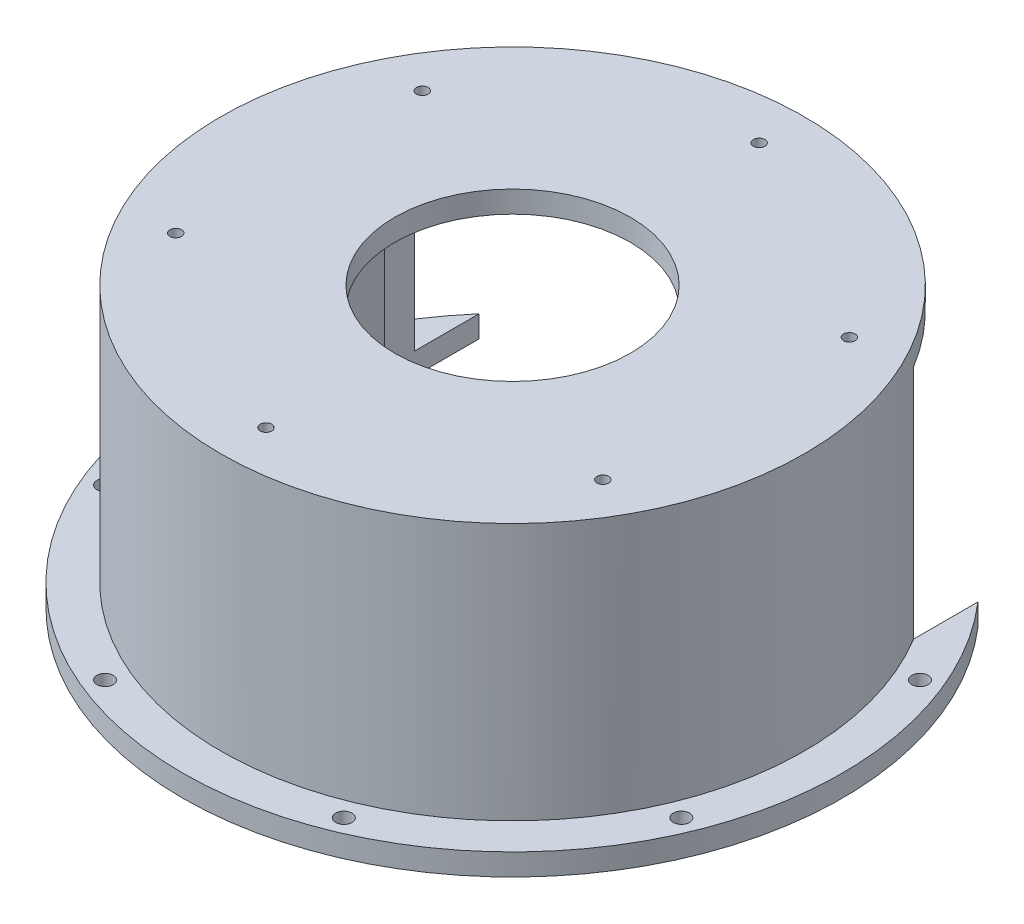
ISO-10303-21;
HEADER;
FILE_DESCRIPTION(('STEP AP214'),'2;1');
FILE_NAME('part.step','',(''),(''),'','','');
FILE_SCHEMA(('AUTOMOTIVE_DESIGN { 1 0 10303 214 1 1 1 1 }'));
ENDSEC;
DATA;
#1=APPLICATION_CONTEXT('core data for automotive mechanical design processes');
#2=APPLICATION_PROTOCOL_DEFINITION('international standard','automotive_design',2000,#1);
#3=PRODUCT_CONTEXT('',#1,'mechanical');
#4=PRODUCT('Part','Part','',(#3));
#5=PRODUCT_RELATED_PRODUCT_CATEGORY('part','',(#4));
#6=PRODUCT_DEFINITION_FORMATION('','',#4);
#7=PRODUCT_DEFINITION_CONTEXT('part definition',#1,'design');
#8=PRODUCT_DEFINITION('design','',#6,#7);
#9=PRODUCT_DEFINITION_SHAPE('','',#8);
#10=(LENGTH_UNIT() NAMED_UNIT(*) SI_UNIT(.MILLI.,.METRE.));
#11=(NAMED_UNIT(*) PLANE_ANGLE_UNIT() SI_UNIT($,.RADIAN.));
#12=(NAMED_UNIT(*) SI_UNIT($,.STERADIAN.) SOLID_ANGLE_UNIT());
#13=UNCERTAINTY_MEASURE_WITH_UNIT(LENGTH_MEASURE(1.E-05),#10,'distance_accuracy_value','');
#14=(GEOMETRIC_REPRESENTATION_CONTEXT(3) GLOBAL_UNCERTAINTY_ASSIGNED_CONTEXT((#13)) GLOBAL_UNIT_ASSIGNED_CONTEXT((#10,
#11,#12)) REPRESENTATION_CONTEXT('',''));
#15=CARTESIAN_POINT('',(0.,0.,0.));
#16=DIRECTION('',(0.,0.,1.));
#17=DIRECTION('',(1.,0.,0.));
#18=AXIS2_PLACEMENT_3D('',#15,#16,#17);
#19=CARTESIAN_POINT('',(0.,122.2375,0.));
#20=DIRECTION('',(0.,-1.,0.));
#21=DIRECTION('',(0.,0.,-1.));
#22=AXIS2_PLACEMENT_3D('',#19,#20,#21);
#23=CYLINDRICAL_SURFACE('',#22,121.44375);
#24=CARTESIAN_POINT('',(0.,112.7125,0.));
#25=DIRECTION('',(0.,1.,0.));
#26=DIRECTION('',(0.,0.,1.));
#27=AXIS2_PLACEMENT_3D('',#24,#25,#26);
#28=CIRCLE('',#27,121.44375);
#29=CARTESIAN_POINT('',(-109.22,112.7125,-53.0996799807918));
#30=VERTEX_POINT('',#29);
#31=CARTESIAN_POINT('',(109.22,112.7125,-53.0996799807918));
#32=VERTEX_POINT('',#31);
#33=EDGE_CURVE('E121',#30,#32,#28,.T.);
#34=ORIENTED_EDGE('',*,*,#33,.T.);
#35=DIRECTION('',(0.,-1.,0.));
#36=VECTOR('',#35,1.);
#37=CARTESIAN_POINT('',(109.22,349.489184835864,-53.0996799807918));
#38=LINE('',#37,#36);
#39=CARTESIAN_POINT('',(109.22,0.,-53.0996799807918));
#40=VERTEX_POINT('',#39);
#41=EDGE_CURVE('E120',#32,#40,#38,.T.);
#42=ORIENTED_EDGE('',*,*,#41,.T.);
#43=CARTESIAN_POINT('',(0.,0.,0.));
#44=DIRECTION('',(0.,-1.,0.));
#45=DIRECTION('',(0.,0.,-1.));
#46=AXIS2_PLACEMENT_3D('',#43,#44,#45);
#47=CIRCLE('',#46,121.44375);
#48=CARTESIAN_POINT('',(-109.22,0.,-53.0996799807918));
#49=VERTEX_POINT('',#48);
#50=EDGE_CURVE('E114',#40,#49,#47,.T.);
#51=ORIENTED_EDGE('',*,*,#50,.T.);
#52=DIRECTION('',(0.,-1.,0.));
#53=VECTOR('',#52,1.);
#54=CARTESIAN_POINT('',(-109.22,349.489184835864,-53.0996799807918));
#55=LINE('',#54,#53);
#56=EDGE_CURVE('E98',#30,#49,#55,.T.);
#57=ORIENTED_EDGE('',*,*,#56,.F.);
#58=EDGE_LOOP('',(#34,#42,#51,#57));
#59=FACE_BOUND('',#58,.T.);
#60=ADVANCED_FACE('F47',(#59),#23,.F.);
#61=CARTESIAN_POINT('',(0.,9.525,0.));
#62=DIRECTION('',(0.,-1.,0.));
#63=DIRECTION('',(0.,0.,-1.));
#64=AXIS2_PLACEMENT_3D('',#61,#62,#63);
#65=CYLINDRICAL_SURFACE('',#64,144.4625);
#66=CARTESIAN_POINT('',(0.,9.525,0.));
#67=DIRECTION('',(0.,1.,0.));
#68=DIRECTION('',(0.,0.,1.));
#69=AXIS2_PLACEMENT_3D('',#66,#67,#68);
#70=CIRCLE('',#69,144.4625);
#71=CARTESIAN_POINT('',(-109.22,9.525,-94.5537175696969));
#72=VERTEX_POINT('',#71);
#73=CARTESIAN_POINT('',(109.22,9.525,-94.5537175696969));
#74=VERTEX_POINT('',#73);
#75=EDGE_CURVE('E11',#72,#74,#70,.T.);
#76=ORIENTED_EDGE('',*,*,#75,.F.);
#77=DIRECTION('',(0.,-1.,0.));
#78=VECTOR('',#77,1.);
#79=CARTESIAN_POINT('',(-109.22,9.525,-94.5537175696968));
#80=LINE('',#79,#78);
#81=CARTESIAN_POINT('',(-109.22,0.,-94.5537175696969));
#82=VERTEX_POINT('',#81);
#83=EDGE_CURVE('E69',#72,#82,#80,.T.);
#84=ORIENTED_EDGE('',*,*,#83,.T.);
#85=CARTESIAN_POINT('',(0.,0.,0.));
#86=DIRECTION('',(0.,1.,0.));
#87=DIRECTION('',(0.,0.,1.));
#88=AXIS2_PLACEMENT_3D('',#85,#86,#87);
#89=CIRCLE('',#88,144.4625);
#90=CARTESIAN_POINT('',(109.22,0.,-94.5537175696969));
#91=VERTEX_POINT('',#90);
#92=EDGE_CURVE('E51',#82,#91,#89,.T.);
#93=ORIENTED_EDGE('',*,*,#92,.T.);
#94=DIRECTION('',(0.,-1.,0.));
#95=VECTOR('',#94,1.);
#96=CARTESIAN_POINT('',(109.22,9.525,-94.5537175696968));
#97=LINE('',#96,#95);
#98=EDGE_CURVE('E178',#74,#91,#97,.T.);
#99=ORIENTED_EDGE('',*,*,#98,.F.);
#100=EDGE_LOOP('',(#76,#84,#93,#99));
#101=FACE_BOUND('',#100,.T.);
#102=ADVANCED_FACE('F49',(#101),#65,.T.);
#103=CARTESIAN_POINT('',(0.,9.525,0.));
#104=DIRECTION('',(0.,1.,0.));
#105=DIRECTION('',(0.,0.,1.));
#106=AXIS2_PLACEMENT_3D('',#103,#104,#105);
#107=PLANE('',#106);
#108=DIRECTION('',(0.,0.,1.));
#109=VECTOR('',#108,1.);
#110=CARTESIAN_POINT('',(-109.22,9.525,0.));
#111=LINE('',#110,#109);
#112=CARTESIAN_POINT('',(-109.22,9.52500000000001,-66.3493341267453));
#113=VERTEX_POINT('',#112);
#114=EDGE_CURVE('E180',#72,#113,#111,.T.);
#115=ORIENTED_EDGE('',*,*,#114,.F.);
#116=ORIENTED_EDGE('',*,*,#75,.T.);
#117=DIRECTION('',(0.,0.,1.));
#118=VECTOR('',#117,1.);
#119=CARTESIAN_POINT('',(109.22,9.525,0.));
#120=LINE('',#119,#118);
#121=CARTESIAN_POINT('',(109.22,9.52500000000001,-66.3493341267453));
#122=VERTEX_POINT('',#121);
#123=EDGE_CURVE('E229',#74,#122,#120,.T.);
#124=ORIENTED_EDGE('',*,*,#123,.T.);
#125=CARTESIAN_POINT('',(0.,9.525,0.));
#126=DIRECTION('',(0.,1.,0.));
#127=DIRECTION('',(0.,0.,1.));
#128=AXIS2_PLACEMENT_3D('',#125,#126,#127);
#129=CIRCLE('',#128,127.79375);
#130=EDGE_CURVE('E124',#113,#122,#129,.T.);
#131=ORIENTED_EDGE('',*,*,#130,.F.);
#132=EDGE_LOOP('',(#115,#116,#124,#131));
#133=FACE_BOUND('',#132,.T.);
#134=CARTESIAN_POINT('',(126.132653176103,9.525,-52.245855603644));
#135=DIRECTION('',(0.,1.,0.));
#136=DIRECTION('',(0.,0.,1.));
#137=AXIS2_PLACEMENT_3D('',#134,#135,#136);
#138=CIRCLE('',#137,3.57123999999998);
#139=CARTESIAN_POINT('',(126.132653176103,9.525,-48.674615603644));
#140=VERTEX_POINT('',#139);
#141=EDGE_CURVE('E134',#140,#140,#138,.T.);
#142=ORIENTED_EDGE('',*,*,#141,.F.);
#143=EDGE_LOOP('',(#142));
#144=FACE_BOUND('',#143,.T.);
#145=CARTESIAN_POINT('',(126.132653176103,9.525,52.2458556036438));
#146=DIRECTION('',(0.,1.,0.));
#147=DIRECTION('',(0.,0.,1.));
#148=AXIS2_PLACEMENT_3D('',#145,#146,#147);
#149=CIRCLE('',#148,3.57123999999998);
#150=CARTESIAN_POINT('',(126.132653176103,9.525,55.8170956036438));
#151=VERTEX_POINT('',#150);
#152=EDGE_CURVE('E142',#151,#151,#149,.T.);
#153=ORIENTED_EDGE('',*,*,#152,.F.);
#154=EDGE_LOOP('',(#153));
#155=FACE_BOUND('',#154,.T.);
#156=CARTESIAN_POINT('',(52.245855603644,9.525,126.132653176103));
#157=DIRECTION('',(0.,1.,0.));
#158=DIRECTION('',(0.,0.,1.));
#159=AXIS2_PLACEMENT_3D('',#156,#157,#158);
#160=CIRCLE('',#159,3.57123999999999);
#161=CARTESIAN_POINT('',(52.245855603644,9.525,129.703893176103));
#162=VERTEX_POINT('',#161);
#163=EDGE_CURVE('E148',#162,#162,#160,.T.);
#164=ORIENTED_EDGE('',*,*,#163,.F.);
#165=EDGE_LOOP('',(#164));
#166=FACE_BOUND('',#165,.T.);
#167=CARTESIAN_POINT('',(-52.2458556036438,9.525,126.132653176103));
#168=DIRECTION('',(0.,1.,0.));
#169=DIRECTION('',(0.,0.,1.));
#170=AXIS2_PLACEMENT_3D('',#167,#168,#169);
#171=CIRCLE('',#170,3.57123999999999);
#172=CARTESIAN_POINT('',(-52.2458556036438,9.525,129.703893176103));
#173=VERTEX_POINT('',#172);
#174=EDGE_CURVE('E154',#173,#173,#171,.T.);
#175=ORIENTED_EDGE('',*,*,#174,.F.);
#176=EDGE_LOOP('',(#175));
#177=FACE_BOUND('',#176,.T.);
#178=CARTESIAN_POINT('',(-126.132653176103,9.525,52.245855603644));
#179=DIRECTION('',(0.,1.,0.));
#180=DIRECTION('',(0.,0.,1.));
#181=AXIS2_PLACEMENT_3D('',#178,#179,#180);
#182=CIRCLE('',#181,3.57123999999999);
#183=CARTESIAN_POINT('',(-126.132653176103,9.525,55.817095603644));
#184=VERTEX_POINT('',#183);
#185=EDGE_CURVE('E160',#184,#184,#182,.T.);
#186=ORIENTED_EDGE('',*,*,#185,.F.);
#187=EDGE_LOOP('',(#186));
#188=FACE_BOUND('',#187,.T.);
#189=CARTESIAN_POINT('',(-126.132653176103,9.525,-52.2458556036438));
#190=DIRECTION('',(0.,1.,0.));
#191=DIRECTION('',(0.,0.,1.));
#192=AXIS2_PLACEMENT_3D('',#189,#190,#191);
#193=CIRCLE('',#192,3.57123999999999);
#194=CARTESIAN_POINT('',(-126.132653176103,9.525,-48.6746156036438));
#195=VERTEX_POINT('',#194);
#196=EDGE_CURVE('E166',#195,#195,#193,.T.);
#197=ORIENTED_EDGE('',*,*,#196,.F.);
#198=EDGE_LOOP('',(#197));
#199=FACE_BOUND('',#198,.T.);
#200=ADVANCED_FACE('F298',(#133,#144,#155,#166,#177,#188,#199),#107,.T.);
#201=CARTESIAN_POINT('',(0.,0.,0.));
#202=DIRECTION('',(0.,1.,0.));
#203=DIRECTION('',(0.,0.,1.));
#204=AXIS2_PLACEMENT_3D('',#201,#202,#203);
#205=PLANE('',#204);
#206=CARTESIAN_POINT('',(126.132653176103,0.,-52.245855603644));
#207=DIRECTION('',(0.,1.,0.));
#208=DIRECTION('',(0.,0.,1.));
#209=AXIS2_PLACEMENT_3D('',#206,#207,#208);
#210=CIRCLE('',#209,3.57123999999999);
#211=CARTESIAN_POINT('',(126.132653176103,0.,-48.674615603644));
#212=VERTEX_POINT('',#211);
#213=EDGE_CURVE('E139',#212,#212,#210,.T.);
#214=ORIENTED_EDGE('',*,*,#213,.T.);
#215=EDGE_LOOP('',(#214));
#216=FACE_BOUND('',#215,.T.);
#217=CARTESIAN_POINT('',(126.132653176103,0.,52.2458556036438));
#218=DIRECTION('',(0.,1.,0.));
#219=DIRECTION('',(0.,0.,1.));
#220=AXIS2_PLACEMENT_3D('',#217,#218,#219);
#221=CIRCLE('',#220,3.57123999999999);
#222=CARTESIAN_POINT('',(126.132653176103,0.,55.8170956036438));
#223=VERTEX_POINT('',#222);
#224=EDGE_CURVE('E145',#223,#223,#221,.T.);
#225=ORIENTED_EDGE('',*,*,#224,.T.);
#226=EDGE_LOOP('',(#225));
#227=FACE_BOUND('',#226,.T.);
#228=CARTESIAN_POINT('',(52.245855603644,0.,126.132653176103));
#229=DIRECTION('',(0.,1.,0.));
#230=DIRECTION('',(0.,0.,1.));
#231=AXIS2_PLACEMENT_3D('',#228,#229,#230);
#232=CIRCLE('',#231,3.57123999999999);
#233=CARTESIAN_POINT('',(52.245855603644,0.,129.703893176103));
#234=VERTEX_POINT('',#233);
#235=EDGE_CURVE('E151',#234,#234,#232,.T.);
#236=ORIENTED_EDGE('',*,*,#235,.T.);
#237=EDGE_LOOP('',(#236));
#238=FACE_BOUND('',#237,.T.);
#239=CARTESIAN_POINT('',(-52.2458556036438,0.,126.132653176103));
#240=DIRECTION('',(0.,1.,0.));
#241=DIRECTION('',(0.,0.,1.));
#242=AXIS2_PLACEMENT_3D('',#239,#240,#241);
#243=CIRCLE('',#242,3.57123999999999);
#244=CARTESIAN_POINT('',(-52.2458556036438,0.,129.703893176103));
#245=VERTEX_POINT('',#244);
#246=EDGE_CURVE('E157',#245,#245,#243,.T.);
#247=ORIENTED_EDGE('',*,*,#246,.T.);
#248=EDGE_LOOP('',(#247));
#249=FACE_BOUND('',#248,.T.);
#250=CARTESIAN_POINT('',(-126.132653176103,0.,52.245855603644));
#251=DIRECTION('',(0.,1.,0.));
#252=DIRECTION('',(0.,0.,1.));
#253=AXIS2_PLACEMENT_3D('',#250,#251,#252);
#254=CIRCLE('',#253,3.57124);
#255=CARTESIAN_POINT('',(-126.132653176103,0.,55.817095603644));
#256=VERTEX_POINT('',#255);
#257=EDGE_CURVE('E163',#256,#256,#254,.T.);
#258=ORIENTED_EDGE('',*,*,#257,.T.);
#259=EDGE_LOOP('',(#258));
#260=FACE_BOUND('',#259,.T.);
#261=CARTESIAN_POINT('',(-126.132653176103,0.,-52.2458556036438));
#262=DIRECTION('',(0.,1.,0.));
#263=DIRECTION('',(0.,0.,1.));
#264=AXIS2_PLACEMENT_3D('',#261,#262,#263);
#265=CIRCLE('',#264,3.57124);
#266=CARTESIAN_POINT('',(-126.132653176103,0.,-48.6746156036438));
#267=VERTEX_POINT('',#266);
#268=EDGE_CURVE('E169',#267,#267,#265,.T.);
#269=ORIENTED_EDGE('',*,*,#268,.T.);
#270=EDGE_LOOP('',(#269));
#271=FACE_BOUND('',#270,.T.);
#272=ORIENTED_EDGE('',*,*,#92,.F.);
#273=DIRECTION('',(0.,0.,-1.));
#274=VECTOR('',#273,1.);
#275=CARTESIAN_POINT('',(-109.22,0.,-53.0996799807918));
#276=LINE('',#275,#274);
#277=EDGE_CURVE('E101',#49,#82,#276,.T.);
#278=ORIENTED_EDGE('',*,*,#277,.F.);
#279=ORIENTED_EDGE('',*,*,#50,.F.);
#280=DIRECTION('',(0.,0.,-1.));
#281=VECTOR('',#280,1.);
#282=CARTESIAN_POINT('',(109.22,0.,-53.0996799807918));
#283=LINE('',#282,#281);
#284=EDGE_CURVE('E107',#40,#91,#283,.T.);
#285=ORIENTED_EDGE('',*,*,#284,.T.);
#286=EDGE_LOOP('',(#272,#278,#279,#285));
#287=FACE_BOUND('',#286,.T.);
#288=ADVANCED_FACE('F112',(#216,#227,#238,#249,#260,#271,#287),#205,.F.);
#289=CARTESIAN_POINT('',(-126.132653176103,9.525,-52.2458556036438));
#290=DIRECTION('',(0.,1.,0.));
#291=DIRECTION('',(0.,0.,1.));
#292=AXIS2_PLACEMENT_3D('',#289,#290,#291);
#293=CYLINDRICAL_SURFACE('',#292,3.57124);
#294=ORIENTED_EDGE('',*,*,#268,.F.);
#295=EDGE_LOOP('',(#294));
#296=FACE_BOUND('',#295,.T.);
#297=ORIENTED_EDGE('',*,*,#196,.T.);
#298=EDGE_LOOP('',(#297));
#299=FACE_BOUND('',#298,.T.);
#300=ADVANCED_FACE('F320',(#296,#299),#293,.F.);
#301=CARTESIAN_POINT('',(-126.132653176103,9.525,52.245855603644));
#302=DIRECTION('',(0.,1.,0.));
#303=DIRECTION('',(0.,0.,1.));
#304=AXIS2_PLACEMENT_3D('',#301,#302,#303);
#305=CYLINDRICAL_SURFACE('',#304,3.57124);
#306=ORIENTED_EDGE('',*,*,#257,.F.);
#307=EDGE_LOOP('',(#306));
#308=FACE_BOUND('',#307,.T.);
#309=ORIENTED_EDGE('',*,*,#185,.T.);
#310=EDGE_LOOP('',(#309));
#311=FACE_BOUND('',#310,.T.);
#312=ADVANCED_FACE('F316',(#308,#311),#305,.F.);
#313=CARTESIAN_POINT('',(-52.2458556036438,9.525,126.132653176103));
#314=DIRECTION('',(0.,1.,0.));
#315=DIRECTION('',(0.,0.,1.));
#316=AXIS2_PLACEMENT_3D('',#313,#314,#315);
#317=CYLINDRICAL_SURFACE('',#316,3.57123999999999);
#318=ORIENTED_EDGE('',*,*,#246,.F.);
#319=EDGE_LOOP('',(#318));
#320=FACE_BOUND('',#319,.T.);
#321=ORIENTED_EDGE('',*,*,#174,.T.);
#322=EDGE_LOOP('',(#321));
#323=FACE_BOUND('',#322,.T.);
#324=ADVANCED_FACE('F312',(#320,#323),#317,.F.);
#325=CARTESIAN_POINT('',(52.245855603644,9.525,126.132653176103));
#326=DIRECTION('',(0.,1.,0.));
#327=DIRECTION('',(0.,0.,1.));
#328=AXIS2_PLACEMENT_3D('',#325,#326,#327);
#329=CYLINDRICAL_SURFACE('',#328,3.57123999999999);
#330=ORIENTED_EDGE('',*,*,#235,.F.);
#331=EDGE_LOOP('',(#330));
#332=FACE_BOUND('',#331,.T.);
#333=ORIENTED_EDGE('',*,*,#163,.T.);
#334=EDGE_LOOP('',(#333));
#335=FACE_BOUND('',#334,.T.);
#336=ADVANCED_FACE('F308',(#332,#335),#329,.F.);
#337=CARTESIAN_POINT('',(126.132653176103,9.525,52.2458556036438));
#338=DIRECTION('',(0.,1.,0.));
#339=DIRECTION('',(0.,0.,1.));
#340=AXIS2_PLACEMENT_3D('',#337,#338,#339);
#341=CYLINDRICAL_SURFACE('',#340,3.57123999999999);
#342=ORIENTED_EDGE('',*,*,#224,.F.);
#343=EDGE_LOOP('',(#342));
#344=FACE_BOUND('',#343,.T.);
#345=ORIENTED_EDGE('',*,*,#152,.T.);
#346=EDGE_LOOP('',(#345));
#347=FACE_BOUND('',#346,.T.);
#348=ADVANCED_FACE('F304',(#344,#347),#341,.F.);
#349=CARTESIAN_POINT('',(126.132653176103,9.525,-52.245855603644));
#350=DIRECTION('',(0.,1.,0.));
#351=DIRECTION('',(0.,0.,1.));
#352=AXIS2_PLACEMENT_3D('',#349,#350,#351);
#353=CYLINDRICAL_SURFACE('',#352,3.57123999999999);
#354=ORIENTED_EDGE('',*,*,#213,.F.);
#355=EDGE_LOOP('',(#354));
#356=FACE_BOUND('',#355,.T.);
#357=ORIENTED_EDGE('',*,*,#141,.T.);
#358=EDGE_LOOP('',(#357));
#359=FACE_BOUND('',#358,.T.);
#360=ADVANCED_FACE('F198',(#356,#359),#353,.F.);
#361=CARTESIAN_POINT('',(0.,122.2375,0.));
#362=DIRECTION('',(0.,1.,0.));
#363=DIRECTION('',(0.,0.,1.));
#364=AXIS2_PLACEMENT_3D('',#361,#362,#363);
#365=PLANE('',#364);
#366=CARTESIAN_POINT('',(0.,122.2375,107.95));
#367=DIRECTION('',(0.,1.,0.));
#368=DIRECTION('',(0.,0.,1.));
#369=AXIS2_PLACEMENT_3D('',#366,#367,#368);
#370=CIRCLE('',#369,2.5527);
#371=CARTESIAN_POINT('',(0.,122.2375,110.5027));
#372=VERTEX_POINT('',#371);
#373=EDGE_CURVE('E261',#372,#372,#370,.T.);
#374=ORIENTED_EDGE('',*,*,#373,.F.);
#375=EDGE_LOOP('',(#374));
#376=FACE_BOUND('',#375,.T.);
#377=CARTESIAN_POINT('',(-93.4874423385302,122.2375,53.9749999999998));
#378=DIRECTION('',(0.,1.,0.));
#379=DIRECTION('',(0.,0.,1.));
#380=AXIS2_PLACEMENT_3D('',#377,#378,#379);
#381=CIRCLE('',#380,2.55270000000001);
#382=CARTESIAN_POINT('',(-93.4874423385302,122.2375,56.5276999999998));
#383=VERTEX_POINT('',#382);
#384=EDGE_CURVE('E255',#383,#383,#381,.T.);
#385=ORIENTED_EDGE('',*,*,#384,.F.);
#386=EDGE_LOOP('',(#385));
#387=FACE_BOUND('',#386,.T.);
#388=CARTESIAN_POINT('',(-93.4874423385299,122.2375,-53.9750000000004));
#389=DIRECTION('',(0.,1.,0.));
#390=DIRECTION('',(0.,0.,1.));
#391=AXIS2_PLACEMENT_3D('',#388,#389,#390);
#392=CIRCLE('',#391,2.55270000000001);
#393=CARTESIAN_POINT('',(-93.4874423385299,122.2375,-51.4223000000004));
#394=VERTEX_POINT('',#393);
#395=EDGE_CURVE('E249',#394,#394,#392,.T.);
#396=ORIENTED_EDGE('',*,*,#395,.F.);
#397=EDGE_LOOP('',(#396));
#398=FACE_BOUND('',#397,.T.);
#399=CARTESIAN_POINT('',(7.53810821056232E-13,122.2375,-107.95));
#400=DIRECTION('',(0.,1.,0.));
#401=DIRECTION('',(0.,0.,1.));
#402=AXIS2_PLACEMENT_3D('',#399,#400,#401);
#403=CIRCLE('',#402,2.5527);
#404=CARTESIAN_POINT('',(7.53810821056232E-13,122.2375,-105.3973));
#405=VERTEX_POINT('',#404);
#406=EDGE_CURVE('E243',#405,#405,#403,.T.);
#407=ORIENTED_EDGE('',*,*,#406,.F.);
#408=EDGE_LOOP('',(#407));
#409=FACE_BOUND('',#408,.T.);
#410=CARTESIAN_POINT('',(93.4874423385306,122.2375,-53.9749999999991));
#411=DIRECTION('',(0.,1.,0.));
#412=DIRECTION('',(0.,0.,1.));
#413=AXIS2_PLACEMENT_3D('',#410,#411,#412);
#414=CIRCLE('',#413,2.55270000000001);
#415=CARTESIAN_POINT('',(93.4874423385306,122.2375,-51.4222999999991));
#416=VERTEX_POINT('',#415);
#417=EDGE_CURVE('E237',#416,#416,#414,.T.);
#418=ORIENTED_EDGE('',*,*,#417,.F.);
#419=EDGE_LOOP('',(#418));
#420=FACE_BOUND('',#419,.T.);
#421=CARTESIAN_POINT('',(93.4874423385295,122.2375,53.9750000000011));
#422=DIRECTION('',(0.,1.,0.));
#423=DIRECTION('',(0.,0.,1.));
#424=AXIS2_PLACEMENT_3D('',#421,#422,#423);
#425=CIRCLE('',#424,2.55270000000001);
#426=CARTESIAN_POINT('',(93.4874423385295,122.2375,56.5277000000011));
#427=VERTEX_POINT('',#426);
#428=EDGE_CURVE('E221',#427,#427,#425,.T.);
#429=ORIENTED_EDGE('',*,*,#428,.F.);
#430=EDGE_LOOP('',(#429));
#431=FACE_BOUND('',#430,.T.);
#432=CARTESIAN_POINT('',(0.,122.2375,0.));
#433=DIRECTION('',(0.,1.,0.));
#434=DIRECTION('',(0.,0.,1.));
#435=AXIS2_PLACEMENT_3D('',#432,#433,#434);
#436=CIRCLE('',#435,51.59375);
#437=CARTESIAN_POINT('',(0.,122.2375,51.59375));
#438=VERTEX_POINT('',#437);
#439=EDGE_CURVE('E127',#438,#438,#436,.T.);
#440=ORIENTED_EDGE('',*,*,#439,.F.);
#441=EDGE_LOOP('',(#440));
#442=FACE_BOUND('',#441,.T.);
#443=CARTESIAN_POINT('',(0.,122.2375,0.));
#444=DIRECTION('',(0.,1.,0.));
#445=DIRECTION('',(0.,0.,1.));
#446=AXIS2_PLACEMENT_3D('',#443,#444,#445);
#447=CIRCLE('',#446,127.79375);
#448=CARTESIAN_POINT('',(0.,122.2375,127.79375));
#449=VERTEX_POINT('',#448);
#450=EDGE_CURVE('E131',#449,#449,#447,.T.);
#451=ORIENTED_EDGE('',*,*,#450,.T.);
#452=EDGE_LOOP('',(#451));
#453=FACE_BOUND('',#452,.T.);
#454=ADVANCED_FACE('F194',(#376,#387,#398,#409,#420,#431,#442,#453),#365,.T.);
#455=CARTESIAN_POINT('',(0.,122.2375,0.));
#456=DIRECTION('',(0.,-1.,0.));
#457=DIRECTION('',(0.,0.,-1.));
#458=AXIS2_PLACEMENT_3D('',#455,#456,#457);
#459=CYLINDRICAL_SURFACE('',#458,127.79375);
#460=ORIENTED_EDGE('',*,*,#450,.F.);
#461=EDGE_LOOP('',(#460));
#462=FACE_BOUND('',#461,.T.);
#463=CARTESIAN_POINT('',(0.,112.7125,0.));
#464=DIRECTION('',(0.,1.,0.));
#465=DIRECTION('',(0.,0.,1.));
#466=AXIS2_PLACEMENT_3D('',#463,#464,#465);
#467=CIRCLE('',#466,127.79375);
#468=CARTESIAN_POINT('',(109.22,112.7125,-66.3493341267453));
#469=VERTEX_POINT('',#468);
#470=CARTESIAN_POINT('',(-109.22,112.7125,-66.3493341267453));
#471=VERTEX_POINT('',#470);
#472=EDGE_CURVE('E179',#469,#471,#467,.T.);
#473=ORIENTED_EDGE('',*,*,#472,.T.);
#474=DIRECTION('',(0.,-1.,0.));
#475=VECTOR('',#474,1.);
#476=CARTESIAN_POINT('',(-109.22,122.2375,-66.3493341267453));
#477=LINE('',#476,#475);
#478=EDGE_CURVE('E185',#471,#113,#477,.T.);
#479=ORIENTED_EDGE('',*,*,#478,.T.);
#480=ORIENTED_EDGE('',*,*,#130,.T.);
#481=DIRECTION('',(0.,-1.,0.));
#482=VECTOR('',#481,1.);
#483=CARTESIAN_POINT('',(109.22,122.2375,-66.3493341267453));
#484=LINE('',#483,#482);
#485=EDGE_CURVE('E106',#469,#122,#484,.T.);
#486=ORIENTED_EDGE('',*,*,#485,.F.);
#487=EDGE_LOOP('',(#473,#479,#480,#486));
#488=FACE_BOUND('',#487,.T.);
#489=ADVANCED_FACE('F197',(#462,#488),#459,.T.);
#490=CARTESIAN_POINT('',(0.,112.7125,0.));
#491=DIRECTION('',(0.,1.,0.));
#492=DIRECTION('',(0.,0.,1.));
#493=AXIS2_PLACEMENT_3D('',#490,#491,#492);
#494=PLANE('',#493);
#495=CARTESIAN_POINT('',(0.,112.7125,107.95));
#496=DIRECTION('',(0.,1.,0.));
#497=DIRECTION('',(0.,0.,1.));
#498=AXIS2_PLACEMENT_3D('',#495,#496,#497);
#499=CIRCLE('',#498,2.5527);
#500=CARTESIAN_POINT('',(0.,112.7125,110.5027));
#501=VERTEX_POINT('',#500);
#502=EDGE_CURVE('E258',#501,#501,#499,.T.);
#503=ORIENTED_EDGE('',*,*,#502,.T.);
#504=EDGE_LOOP('',(#503));
#505=FACE_BOUND('',#504,.T.);
#506=CARTESIAN_POINT('',(-93.4874423385302,112.7125,53.9749999999998));
#507=DIRECTION('',(0.,1.,0.));
#508=DIRECTION('',(0.,0.,1.));
#509=AXIS2_PLACEMENT_3D('',#506,#507,#508);
#510=CIRCLE('',#509,2.55270000000001);
#511=CARTESIAN_POINT('',(-93.4874423385302,112.7125,56.5276999999998));
#512=VERTEX_POINT('',#511);
#513=EDGE_CURVE('E252',#512,#512,#510,.T.);
#514=ORIENTED_EDGE('',*,*,#513,.T.);
#515=EDGE_LOOP('',(#514));
#516=FACE_BOUND('',#515,.T.);
#517=CARTESIAN_POINT('',(-93.4874423385299,112.7125,-53.9750000000004));
#518=DIRECTION('',(0.,1.,0.));
#519=DIRECTION('',(0.,0.,1.));
#520=AXIS2_PLACEMENT_3D('',#517,#518,#519);
#521=CIRCLE('',#520,2.55270000000001);
#522=CARTESIAN_POINT('',(-93.4874423385299,112.7125,-51.4223000000004));
#523=VERTEX_POINT('',#522);
#524=EDGE_CURVE('E246',#523,#523,#521,.T.);
#525=ORIENTED_EDGE('',*,*,#524,.T.);
#526=EDGE_LOOP('',(#525));
#527=FACE_BOUND('',#526,.T.);
#528=CARTESIAN_POINT('',(7.53810821056232E-13,112.7125,-107.95));
#529=DIRECTION('',(0.,1.,0.));
#530=DIRECTION('',(0.,0.,1.));
#531=AXIS2_PLACEMENT_3D('',#528,#529,#530);
#532=CIRCLE('',#531,2.5527);
#533=CARTESIAN_POINT('',(7.53810821056232E-13,112.7125,-105.3973));
#534=VERTEX_POINT('',#533);
#535=EDGE_CURVE('E240',#534,#534,#532,.T.);
#536=ORIENTED_EDGE('',*,*,#535,.T.);
#537=EDGE_LOOP('',(#536));
#538=FACE_BOUND('',#537,.T.);
#539=CARTESIAN_POINT('',(93.4874423385306,112.7125,-53.9749999999991));
#540=DIRECTION('',(0.,1.,0.));
#541=DIRECTION('',(0.,0.,1.));
#542=AXIS2_PLACEMENT_3D('',#539,#540,#541);
#543=CIRCLE('',#542,2.55270000000001);
#544=CARTESIAN_POINT('',(93.4874423385306,112.7125,-51.4222999999991));
#545=VERTEX_POINT('',#544);
#546=EDGE_CURVE('E234',#545,#545,#543,.T.);
#547=ORIENTED_EDGE('',*,*,#546,.T.);
#548=EDGE_LOOP('',(#547));
#549=FACE_BOUND('',#548,.T.);
#550=CARTESIAN_POINT('',(93.4874423385295,112.7125,53.9750000000011));
#551=DIRECTION('',(0.,1.,0.));
#552=DIRECTION('',(0.,0.,1.));
#553=AXIS2_PLACEMENT_3D('',#550,#551,#552);
#554=CIRCLE('',#553,2.5527);
#555=CARTESIAN_POINT('',(93.4874423385295,112.7125,56.5277000000011));
#556=VERTEX_POINT('',#555);
#557=EDGE_CURVE('E218',#556,#556,#554,.T.);
#558=ORIENTED_EDGE('',*,*,#557,.T.);
#559=EDGE_LOOP('',(#558));
#560=FACE_BOUND('',#559,.T.);
#561=DIRECTION('',(0.,0.,-1.));
#562=VECTOR('',#561,1.);
#563=CARTESIAN_POINT('',(109.22,112.7125,-53.0996799807918));
#564=LINE('',#563,#562);
#565=EDGE_CURVE('E117',#32,#469,#564,.T.);
#566=ORIENTED_EDGE('',*,*,#565,.F.);
#567=ORIENTED_EDGE('',*,*,#33,.F.);
#568=DIRECTION('',(0.,0.,-1.));
#569=VECTOR('',#568,1.);
#570=CARTESIAN_POINT('',(-109.22,112.7125,-53.0996799807918));
#571=LINE('',#570,#569);
#572=EDGE_CURVE('E62',#30,#471,#571,.T.);
#573=ORIENTED_EDGE('',*,*,#572,.T.);
#574=ORIENTED_EDGE('',*,*,#472,.F.);
#575=EDGE_LOOP('',(#566,#567,#573,#574));
#576=FACE_BOUND('',#575,.T.);
#577=CARTESIAN_POINT('',(0.,112.7125,0.));
#578=DIRECTION('',(0.,1.,0.));
#579=DIRECTION('',(0.,0.,1.));
#580=AXIS2_PLACEMENT_3D('',#577,#578,#579);
#581=CIRCLE('',#580,51.59375);
#582=CARTESIAN_POINT('',(0.,112.7125,51.59375));
#583=VERTEX_POINT('',#582);
#584=EDGE_CURVE('E122',#583,#583,#581,.F.);
#585=ORIENTED_EDGE('',*,*,#584,.F.);
#586=EDGE_LOOP('',(#585));
#587=FACE_BOUND('',#586,.T.);
#588=ADVANCED_FACE('F205',(#505,#516,#527,#538,#549,#560,#576,#587),#494,.F.);
#589=CARTESIAN_POINT('',(0.,-0.001000000000001,0.));
#590=DIRECTION('',(0.,1.,0.));
#591=DIRECTION('',(0.,0.,1.));
#592=AXIS2_PLACEMENT_3D('',#589,#590,#591);
#593=CYLINDRICAL_SURFACE('',#592,51.59375);
#594=ORIENTED_EDGE('',*,*,#439,.T.);
#595=EDGE_LOOP('',(#594));
#596=FACE_BOUND('',#595,.T.);
#597=ORIENTED_EDGE('',*,*,#584,.T.);
#598=EDGE_LOOP('',(#597));
#599=FACE_BOUND('',#598,.T.);
#600=ADVANCED_FACE('F191',(#596,#599),#593,.F.);
#601=CARTESIAN_POINT('',(-109.22,349.489184835864,-53.0996799807918));
#602=DIRECTION('',(-1.,0.,0.));
#603=DIRECTION('',(0.,0.,1.));
#604=AXIS2_PLACEMENT_3D('',#601,#602,#603);
#605=PLANE('',#604);
#606=ORIENTED_EDGE('',*,*,#114,.T.);
#607=ORIENTED_EDGE('',*,*,#478,.F.);
#608=ORIENTED_EDGE('',*,*,#572,.F.);
#609=ORIENTED_EDGE('',*,*,#56,.T.);
#610=ORIENTED_EDGE('',*,*,#277,.T.);
#611=ORIENTED_EDGE('',*,*,#83,.F.);
#612=EDGE_LOOP('',(#606,#607,#608,#609,#610,#611));
#613=FACE_BOUND('',#612,.T.);
#614=ADVANCED_FACE('F100',(#613),#605,.F.);
#615=CARTESIAN_POINT('',(109.22,349.489184835864,-53.0996799807918));
#616=DIRECTION('',(-1.,0.,0.));
#617=DIRECTION('',(0.,0.,1.));
#618=AXIS2_PLACEMENT_3D('',#615,#616,#617);
#619=PLANE('',#618);
#620=ORIENTED_EDGE('',*,*,#98,.T.);
#621=ORIENTED_EDGE('',*,*,#284,.F.);
#622=ORIENTED_EDGE('',*,*,#41,.F.);
#623=ORIENTED_EDGE('',*,*,#565,.T.);
#624=ORIENTED_EDGE('',*,*,#485,.T.);
#625=ORIENTED_EDGE('',*,*,#123,.F.);
#626=EDGE_LOOP('',(#620,#621,#622,#623,#624,#625));
#627=FACE_BOUND('',#626,.T.);
#628=ADVANCED_FACE('F215',(#627),#619,.T.);
#629=CARTESIAN_POINT('',(93.4874423385295,122.2375,53.9750000000011));
#630=DIRECTION('',(0.,1.,0.));
#631=DIRECTION('',(0.,0.,1.));
#632=AXIS2_PLACEMENT_3D('',#629,#630,#631);
#633=CYLINDRICAL_SURFACE('',#632,2.5527);
#634=ORIENTED_EDGE('',*,*,#557,.F.);
#635=EDGE_LOOP('',(#634));
#636=FACE_BOUND('',#635,.T.);
#637=ORIENTED_EDGE('',*,*,#428,.T.);
#638=EDGE_LOOP('',(#637));
#639=FACE_BOUND('',#638,.T.);
#640=ADVANCED_FACE('F277',(#636,#639),#633,.F.);
#641=CARTESIAN_POINT('',(93.4874423385306,122.2375,-53.9749999999991));
#642=DIRECTION('',(0.,1.,0.));
#643=DIRECTION('',(0.,0.,1.));
#644=AXIS2_PLACEMENT_3D('',#641,#642,#643);
#645=CYLINDRICAL_SURFACE('',#644,2.55270000000001);
#646=ORIENTED_EDGE('',*,*,#546,.F.);
#647=EDGE_LOOP('',(#646));
#648=FACE_BOUND('',#647,.T.);
#649=ORIENTED_EDGE('',*,*,#417,.T.);
#650=EDGE_LOOP('',(#649));
#651=FACE_BOUND('',#650,.T.);
#652=ADVANCED_FACE('F279',(#648,#651),#645,.F.);
#653=CARTESIAN_POINT('',(7.53810821056232E-13,122.2375,-107.95));
#654=DIRECTION('',(0.,1.,0.));
#655=DIRECTION('',(0.,0.,1.));
#656=AXIS2_PLACEMENT_3D('',#653,#654,#655);
#657=CYLINDRICAL_SURFACE('',#656,2.5527);
#658=ORIENTED_EDGE('',*,*,#535,.F.);
#659=EDGE_LOOP('',(#658));
#660=FACE_BOUND('',#659,.T.);
#661=ORIENTED_EDGE('',*,*,#406,.T.);
#662=EDGE_LOOP('',(#661));
#663=FACE_BOUND('',#662,.T.);
#664=ADVANCED_FACE('F286',(#660,#663),#657,.F.);
#665=CARTESIAN_POINT('',(-93.4874423385299,122.2375,-53.9750000000004));
#666=DIRECTION('',(0.,1.,0.));
#667=DIRECTION('',(0.,0.,1.));
#668=AXIS2_PLACEMENT_3D('',#665,#666,#667);
#669=CYLINDRICAL_SURFACE('',#668,2.55270000000001);
#670=ORIENTED_EDGE('',*,*,#524,.F.);
#671=EDGE_LOOP('',(#670));
#672=FACE_BOUND('',#671,.T.);
#673=ORIENTED_EDGE('',*,*,#395,.T.);
#674=EDGE_LOOP('',(#673));
#675=FACE_BOUND('',#674,.T.);
#676=ADVANCED_FACE('F421',(#672,#675),#669,.F.);
#677=CARTESIAN_POINT('',(-93.4874423385302,122.2375,53.9749999999998));
#678=DIRECTION('',(0.,1.,0.));
#679=DIRECTION('',(0.,0.,1.));
#680=AXIS2_PLACEMENT_3D('',#677,#678,#679);
#681=CYLINDRICAL_SURFACE('',#680,2.55270000000001);
#682=ORIENTED_EDGE('',*,*,#513,.F.);
#683=EDGE_LOOP('',(#682));
#684=FACE_BOUND('',#683,.T.);
#685=ORIENTED_EDGE('',*,*,#384,.T.);
#686=EDGE_LOOP('',(#685));
#687=FACE_BOUND('',#686,.T.);
#688=ADVANCED_FACE('F430',(#684,#687),#681,.F.);
#689=CARTESIAN_POINT('',(0.,122.2375,107.95));
#690=DIRECTION('',(0.,1.,0.));
#691=DIRECTION('',(0.,0.,1.));
#692=AXIS2_PLACEMENT_3D('',#689,#690,#691);
#693=CYLINDRICAL_SURFACE('',#692,2.5527);
#694=ORIENTED_EDGE('',*,*,#502,.F.);
#695=EDGE_LOOP('',(#694));
#696=FACE_BOUND('',#695,.T.);
#697=ORIENTED_EDGE('',*,*,#373,.T.);
#698=EDGE_LOOP('',(#697));
#699=FACE_BOUND('',#698,.T.);
#700=ADVANCED_FACE('F265',(#696,#699),#693,.F.);
#701=CLOSED_SHELL('',(#60,#102,#200,#288,#300,#312,#324,#336,#348,#360,#454,#489,#588,#600,#614,
#628,#640,#652,#664,#676,#688,#700));
#702=MANIFOLD_SOLID_BREP('B2',#701);
#703=ADVANCED_BREP_SHAPE_REPRESENTATION('',(#18,#702),#14);
#704=SHAPE_DEFINITION_REPRESENTATION(#9,#703);
ENDSEC;
END-ISO-10303-21;
